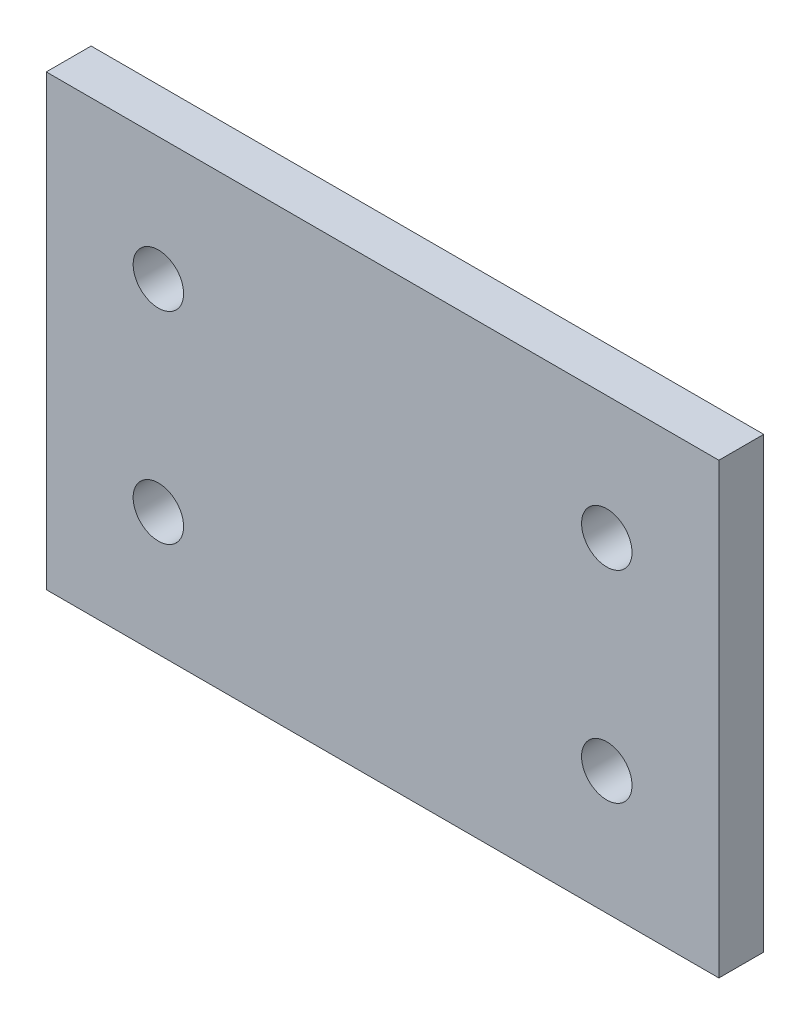
ISO-10303-21;
HEADER;
FILE_DESCRIPTION(('STEP AP214'),'2;1');
FILE_NAME('part.step','',(''),(''),'','','');
FILE_SCHEMA(('AUTOMOTIVE_DESIGN { 1 0 10303 214 1 1 1 1 }'));
ENDSEC;
DATA;
#1=APPLICATION_CONTEXT('core data for automotive mechanical design processes');
#2=APPLICATION_PROTOCOL_DEFINITION('international standard','automotive_design',2000,#1);
#3=PRODUCT_CONTEXT('',#1,'mechanical');
#4=PRODUCT('Part','Part','',(#3));
#5=PRODUCT_RELATED_PRODUCT_CATEGORY('part','',(#4));
#6=PRODUCT_DEFINITION_FORMATION('','',#4);
#7=PRODUCT_DEFINITION_CONTEXT('part definition',#1,'design');
#8=PRODUCT_DEFINITION('design','',#6,#7);
#9=PRODUCT_DEFINITION_SHAPE('','',#8);
#10=(LENGTH_UNIT() NAMED_UNIT(*) SI_UNIT(.MILLI.,.METRE.));
#11=(NAMED_UNIT(*) PLANE_ANGLE_UNIT() SI_UNIT($,.RADIAN.));
#12=(NAMED_UNIT(*) SI_UNIT($,.STERADIAN.) SOLID_ANGLE_UNIT());
#13=UNCERTAINTY_MEASURE_WITH_UNIT(LENGTH_MEASURE(1.E-05),#10,'distance_accuracy_value','');
#14=(GEOMETRIC_REPRESENTATION_CONTEXT(3) GLOBAL_UNCERTAINTY_ASSIGNED_CONTEXT((#13)) GLOBAL_UNIT_ASSIGNED_CONTEXT((#10,
#11,#12)) REPRESENTATION_CONTEXT('',''));
#15=CARTESIAN_POINT('',(0.,0.,0.));
#16=DIRECTION('',(0.,0.,1.));
#17=DIRECTION('',(1.,0.,0.));
#18=AXIS2_PLACEMENT_3D('',#15,#16,#17);
#19=CARTESIAN_POINT('',(0.,0.,4.));
#20=DIRECTION('',(1.,0.,0.));
#21=DIRECTION('',(0.,0.,-1.));
#22=AXIS2_PLACEMENT_3D('',#19,#20,#21);
#23=PLANE('',#22);
#24=DIRECTION('',(0.,-1.,0.));
#25=VECTOR('',#24,1.);
#26=CARTESIAN_POINT('',(0.,0.,0.));
#27=LINE('',#26,#25);
#28=CARTESIAN_POINT('',(0.,40.,0.));
#29=VERTEX_POINT('',#28);
#30=CARTESIAN_POINT('',(0.,0.,0.));
#31=VERTEX_POINT('',#30);
#32=EDGE_CURVE('E96',#29,#31,#27,.T.);
#33=ORIENTED_EDGE('',*,*,#32,.T.);
#34=DIRECTION('',(0.,0.,-1.));
#35=VECTOR('',#34,1.);
#36=CARTESIAN_POINT('',(0.,0.,4.));
#37=LINE('',#36,#35);
#38=CARTESIAN_POINT('',(0.,0.,4.));
#39=VERTEX_POINT('',#38);
#40=EDGE_CURVE('E11',#39,#31,#37,.T.);
#41=ORIENTED_EDGE('',*,*,#40,.F.);
#42=DIRECTION('',(0.,-1.,0.));
#43=VECTOR('',#42,1.);
#44=CARTESIAN_POINT('',(0.,0.,4.));
#45=LINE('',#44,#43);
#46=CARTESIAN_POINT('',(0.,40.,4.));
#47=VERTEX_POINT('',#46);
#48=EDGE_CURVE('E84',#47,#39,#45,.T.);
#49=ORIENTED_EDGE('',*,*,#48,.F.);
#50=DIRECTION('',(0.,0.,-1.));
#51=VECTOR('',#50,1.);
#52=CARTESIAN_POINT('',(0.,40.,4.));
#53=LINE('',#52,#51);
#54=EDGE_CURVE('E92',#47,#29,#53,.T.);
#55=ORIENTED_EDGE('',*,*,#54,.T.);
#56=EDGE_LOOP('',(#33,#41,#49,#55));
#57=FACE_BOUND('',#56,.T.);
#58=ADVANCED_FACE('F33',(#57),#23,.F.);
#59=CARTESIAN_POINT('',(0.,0.,4.));
#60=DIRECTION('',(0.,1.,0.));
#61=DIRECTION('',(0.,0.,1.));
#62=AXIS2_PLACEMENT_3D('',#59,#60,#61);
#63=PLANE('',#62);
#64=DIRECTION('',(1.,0.,0.));
#65=VECTOR('',#64,1.);
#66=CARTESIAN_POINT('',(0.,0.,0.));
#67=LINE('',#66,#65);
#68=CARTESIAN_POINT('',(60.,0.,0.));
#69=VERTEX_POINT('',#68);
#70=EDGE_CURVE('E88',#31,#69,#67,.T.);
#71=ORIENTED_EDGE('',*,*,#70,.T.);
#72=DIRECTION('',(0.,0.,-1.));
#73=VECTOR('',#72,1.);
#74=CARTESIAN_POINT('',(60.,0.,4.));
#75=LINE('',#74,#73);
#76=CARTESIAN_POINT('',(60.,0.,4.));
#77=VERTEX_POINT('',#76);
#78=EDGE_CURVE('E41',#77,#69,#75,.T.);
#79=ORIENTED_EDGE('',*,*,#78,.F.);
#80=DIRECTION('',(1.,0.,0.));
#81=VECTOR('',#80,1.);
#82=CARTESIAN_POINT('',(0.,0.,4.));
#83=LINE('',#82,#81);
#84=EDGE_CURVE('E79',#39,#77,#83,.T.);
#85=ORIENTED_EDGE('',*,*,#84,.F.);
#86=ORIENTED_EDGE('',*,*,#40,.T.);
#87=EDGE_LOOP('',(#71,#79,#85,#86));
#88=FACE_BOUND('',#87,.T.);
#89=ADVANCED_FACE('F87',(#88),#63,.F.);
#90=CARTESIAN_POINT('',(60.,0.,4.));
#91=DIRECTION('',(-1.,0.,0.));
#92=DIRECTION('',(0.,0.,1.));
#93=AXIS2_PLACEMENT_3D('',#90,#91,#92);
#94=PLANE('',#93);
#95=DIRECTION('',(0.,1.,0.));
#96=VECTOR('',#95,1.);
#97=CARTESIAN_POINT('',(60.,0.,0.));
#98=LINE('',#97,#96);
#99=CARTESIAN_POINT('',(60.,40.,0.));
#100=VERTEX_POINT('',#99);
#101=EDGE_CURVE('E66',#69,#100,#98,.T.);
#102=ORIENTED_EDGE('',*,*,#101,.T.);
#103=DIRECTION('',(0.,0.,-1.));
#104=VECTOR('',#103,1.);
#105=CARTESIAN_POINT('',(60.,40.,4.));
#106=LINE('',#105,#104);
#107=CARTESIAN_POINT('',(60.,40.,4.));
#108=VERTEX_POINT('',#107);
#109=EDGE_CURVE('E89',#108,#100,#106,.T.);
#110=ORIENTED_EDGE('',*,*,#109,.F.);
#111=DIRECTION('',(0.,1.,0.));
#112=VECTOR('',#111,1.);
#113=CARTESIAN_POINT('',(60.,0.,4.));
#114=LINE('',#113,#112);
#115=EDGE_CURVE('E82',#77,#108,#114,.T.);
#116=ORIENTED_EDGE('',*,*,#115,.F.);
#117=ORIENTED_EDGE('',*,*,#78,.T.);
#118=EDGE_LOOP('',(#102,#110,#116,#117));
#119=FACE_BOUND('',#118,.T.);
#120=ADVANCED_FACE('F90',(#119),#94,.F.);
#121=CARTESIAN_POINT('',(0.,40.,4.));
#122=DIRECTION('',(0.,-1.,0.));
#123=DIRECTION('',(0.,0.,-1.));
#124=AXIS2_PLACEMENT_3D('',#121,#122,#123);
#125=PLANE('',#124);
#126=DIRECTION('',(-1.,0.,0.));
#127=VECTOR('',#126,1.);
#128=CARTESIAN_POINT('',(0.,40.,0.));
#129=LINE('',#128,#127);
#130=EDGE_CURVE('E72',#100,#29,#129,.T.);
#131=ORIENTED_EDGE('',*,*,#130,.T.);
#132=ORIENTED_EDGE('',*,*,#54,.F.);
#133=DIRECTION('',(-1.,0.,0.));
#134=VECTOR('',#133,1.);
#135=CARTESIAN_POINT('',(0.,40.,4.));
#136=LINE('',#135,#134);
#137=EDGE_CURVE('E49',#108,#47,#136,.T.);
#138=ORIENTED_EDGE('',*,*,#137,.F.);
#139=ORIENTED_EDGE('',*,*,#109,.T.);
#140=EDGE_LOOP('',(#131,#132,#138,#139));
#141=FACE_BOUND('',#140,.T.);
#142=ADVANCED_FACE('F104',(#141),#125,.F.);
#143=CARTESIAN_POINT('',(0.,40.,4.));
#144=DIRECTION('',(0.,0.,-1.));
#145=DIRECTION('',(-1.,0.,0.));
#146=AXIS2_PLACEMENT_3D('',#143,#144,#145);
#147=PLANE('',#146);
#148=CARTESIAN_POINT('',(10.,29.,4.));
#149=DIRECTION('',(0.,0.,1.));
#150=DIRECTION('',(-1.,0.,0.));
#151=AXIS2_PLACEMENT_3D('',#148,#149,#150);
#152=CIRCLE('',#151,2.25000000000001);
#153=CARTESIAN_POINT('',(7.74999999999999,29.,4.));
#154=VERTEX_POINT('',#153);
#155=EDGE_CURVE('E128',#154,#154,#152,.T.);
#156=ORIENTED_EDGE('',*,*,#155,.F.);
#157=EDGE_LOOP('',(#156));
#158=FACE_BOUND('',#157,.T.);
#159=CARTESIAN_POINT('',(50.,29.,4.));
#160=DIRECTION('',(0.,0.,1.));
#161=DIRECTION('',(1.,0.,0.));
#162=AXIS2_PLACEMENT_3D('',#159,#160,#161);
#163=CIRCLE('',#162,2.25);
#164=CARTESIAN_POINT('',(52.25,29.,4.));
#165=VERTEX_POINT('',#164);
#166=EDGE_CURVE('E122',#165,#165,#163,.T.);
#167=ORIENTED_EDGE('',*,*,#166,.F.);
#168=EDGE_LOOP('',(#167));
#169=FACE_BOUND('',#168,.T.);
#170=CARTESIAN_POINT('',(50.,11.,4.));
#171=DIRECTION('',(0.,0.,1.));
#172=DIRECTION('',(-1.,0.,0.));
#173=AXIS2_PLACEMENT_3D('',#170,#171,#172);
#174=CIRCLE('',#173,2.25);
#175=CARTESIAN_POINT('',(47.75,11.,4.));
#176=VERTEX_POINT('',#175);
#177=EDGE_CURVE('E116',#176,#176,#174,.T.);
#178=ORIENTED_EDGE('',*,*,#177,.F.);
#179=EDGE_LOOP('',(#178));
#180=FACE_BOUND('',#179,.T.);
#181=CARTESIAN_POINT('',(10.,11.,4.));
#182=DIRECTION('',(0.,0.,1.));
#183=DIRECTION('',(1.,0.,0.));
#184=AXIS2_PLACEMENT_3D('',#181,#182,#183);
#185=CIRCLE('',#184,2.25);
#186=CARTESIAN_POINT('',(12.25,11.,4.));
#187=VERTEX_POINT('',#186);
#188=EDGE_CURVE('E110',#187,#187,#185,.T.);
#189=ORIENTED_EDGE('',*,*,#188,.F.);
#190=EDGE_LOOP('',(#189));
#191=FACE_BOUND('',#190,.T.);
#192=ORIENTED_EDGE('',*,*,#48,.T.);
#193=ORIENTED_EDGE('',*,*,#84,.T.);
#194=ORIENTED_EDGE('',*,*,#115,.T.);
#195=ORIENTED_EDGE('',*,*,#137,.T.);
#196=EDGE_LOOP('',(#192,#193,#194,#195));
#197=FACE_BOUND('',#196,.T.);
#198=ADVANCED_FACE('F80',(#158,#169,#180,#191,#197),#147,.F.);
#199=CARTESIAN_POINT('',(0.,40.,0.));
#200=DIRECTION('',(0.,0.,-1.));
#201=DIRECTION('',(-1.,0.,0.));
#202=AXIS2_PLACEMENT_3D('',#199,#200,#201);
#203=PLANE('',#202);
#204=CARTESIAN_POINT('',(10.,29.,0.));
#205=DIRECTION('',(0.,0.,1.));
#206=DIRECTION('',(-1.,0.,0.));
#207=AXIS2_PLACEMENT_3D('',#204,#205,#206);
#208=CIRCLE('',#207,2.25000000000001);
#209=CARTESIAN_POINT('',(7.74999999999999,29.,0.));
#210=VERTEX_POINT('',#209);
#211=EDGE_CURVE('E125',#210,#210,#208,.T.);
#212=ORIENTED_EDGE('',*,*,#211,.T.);
#213=EDGE_LOOP('',(#212));
#214=FACE_BOUND('',#213,.T.);
#215=CARTESIAN_POINT('',(50.,29.,0.));
#216=DIRECTION('',(0.,0.,1.));
#217=DIRECTION('',(1.,0.,0.));
#218=AXIS2_PLACEMENT_3D('',#215,#216,#217);
#219=CIRCLE('',#218,2.25);
#220=CARTESIAN_POINT('',(52.25,29.,0.));
#221=VERTEX_POINT('',#220);
#222=EDGE_CURVE('E119',#221,#221,#219,.T.);
#223=ORIENTED_EDGE('',*,*,#222,.T.);
#224=EDGE_LOOP('',(#223));
#225=FACE_BOUND('',#224,.T.);
#226=CARTESIAN_POINT('',(50.,11.,0.));
#227=DIRECTION('',(0.,0.,1.));
#228=DIRECTION('',(-1.,0.,0.));
#229=AXIS2_PLACEMENT_3D('',#226,#227,#228);
#230=CIRCLE('',#229,2.25);
#231=CARTESIAN_POINT('',(47.75,11.,0.));
#232=VERTEX_POINT('',#231);
#233=EDGE_CURVE('E113',#232,#232,#230,.T.);
#234=ORIENTED_EDGE('',*,*,#233,.T.);
#235=EDGE_LOOP('',(#234));
#236=FACE_BOUND('',#235,.T.);
#237=CARTESIAN_POINT('',(10.,11.,0.));
#238=DIRECTION('',(0.,0.,1.));
#239=DIRECTION('',(1.,0.,0.));
#240=AXIS2_PLACEMENT_3D('',#237,#238,#239);
#241=CIRCLE('',#240,2.25);
#242=CARTESIAN_POINT('',(12.25,11.,0.));
#243=VERTEX_POINT('',#242);
#244=EDGE_CURVE('E99',#243,#243,#241,.T.);
#245=ORIENTED_EDGE('',*,*,#244,.T.);
#246=EDGE_LOOP('',(#245));
#247=FACE_BOUND('',#246,.T.);
#248=ORIENTED_EDGE('',*,*,#32,.F.);
#249=ORIENTED_EDGE('',*,*,#130,.F.);
#250=ORIENTED_EDGE('',*,*,#101,.F.);
#251=ORIENTED_EDGE('',*,*,#70,.F.);
#252=EDGE_LOOP('',(#248,#249,#250,#251));
#253=FACE_BOUND('',#252,.T.);
#254=ADVANCED_FACE('F107',(#214,#225,#236,#247,#253),#203,.T.);
#255=CARTESIAN_POINT('',(10.,11.,0.));
#256=DIRECTION('',(0.,0.,1.));
#257=DIRECTION('',(1.,0.,0.));
#258=AXIS2_PLACEMENT_3D('',#255,#256,#257);
#259=CYLINDRICAL_SURFACE('',#258,2.25);
#260=ORIENTED_EDGE('',*,*,#244,.F.);
#261=EDGE_LOOP('',(#260));
#262=FACE_BOUND('',#261,.T.);
#263=ORIENTED_EDGE('',*,*,#188,.T.);
#264=EDGE_LOOP('',(#263));
#265=FACE_BOUND('',#264,.T.);
#266=ADVANCED_FACE('F152',(#262,#265),#259,.F.);
#267=CARTESIAN_POINT('',(50.,11.,0.));
#268=DIRECTION('',(0.,0.,1.));
#269=DIRECTION('',(1.,0.,0.));
#270=AXIS2_PLACEMENT_3D('',#267,#268,#269);
#271=CYLINDRICAL_SURFACE('',#270,2.25);
#272=ORIENTED_EDGE('',*,*,#233,.F.);
#273=EDGE_LOOP('',(#272));
#274=FACE_BOUND('',#273,.T.);
#275=ORIENTED_EDGE('',*,*,#177,.T.);
#276=EDGE_LOOP('',(#275));
#277=FACE_BOUND('',#276,.T.);
#278=ADVANCED_FACE('F154',(#274,#277),#271,.F.);
#279=CARTESIAN_POINT('',(50.,29.,0.));
#280=DIRECTION('',(0.,0.,1.));
#281=DIRECTION('',(1.,0.,0.));
#282=AXIS2_PLACEMENT_3D('',#279,#280,#281);
#283=CYLINDRICAL_SURFACE('',#282,2.25);
#284=ORIENTED_EDGE('',*,*,#222,.F.);
#285=EDGE_LOOP('',(#284));
#286=FACE_BOUND('',#285,.T.);
#287=ORIENTED_EDGE('',*,*,#166,.T.);
#288=EDGE_LOOP('',(#287));
#289=FACE_BOUND('',#288,.T.);
#290=ADVANCED_FACE('F139',(#286,#289),#283,.F.);
#291=CARTESIAN_POINT('',(10.,29.,0.));
#292=DIRECTION('',(0.,0.,1.));
#293=DIRECTION('',(1.,0.,0.));
#294=AXIS2_PLACEMENT_3D('',#291,#292,#293);
#295=CYLINDRICAL_SURFACE('',#294,2.25000000000001);
#296=ORIENTED_EDGE('',*,*,#211,.F.);
#297=EDGE_LOOP('',(#296));
#298=FACE_BOUND('',#297,.T.);
#299=ORIENTED_EDGE('',*,*,#155,.T.);
#300=EDGE_LOOP('',(#299));
#301=FACE_BOUND('',#300,.T.);
#302=ADVANCED_FACE('F136',(#298,#301),#295,.F.);
#303=CLOSED_SHELL('',(#58,#89,#120,#142,#198,#254,#266,#278,#290,#302));
#304=MANIFOLD_SOLID_BREP('B2',#303);
#305=ADVANCED_BREP_SHAPE_REPRESENTATION('',(#18,#304),#14);
#306=SHAPE_DEFINITION_REPRESENTATION(#9,#305);
ENDSEC;
END-ISO-10303-21;
